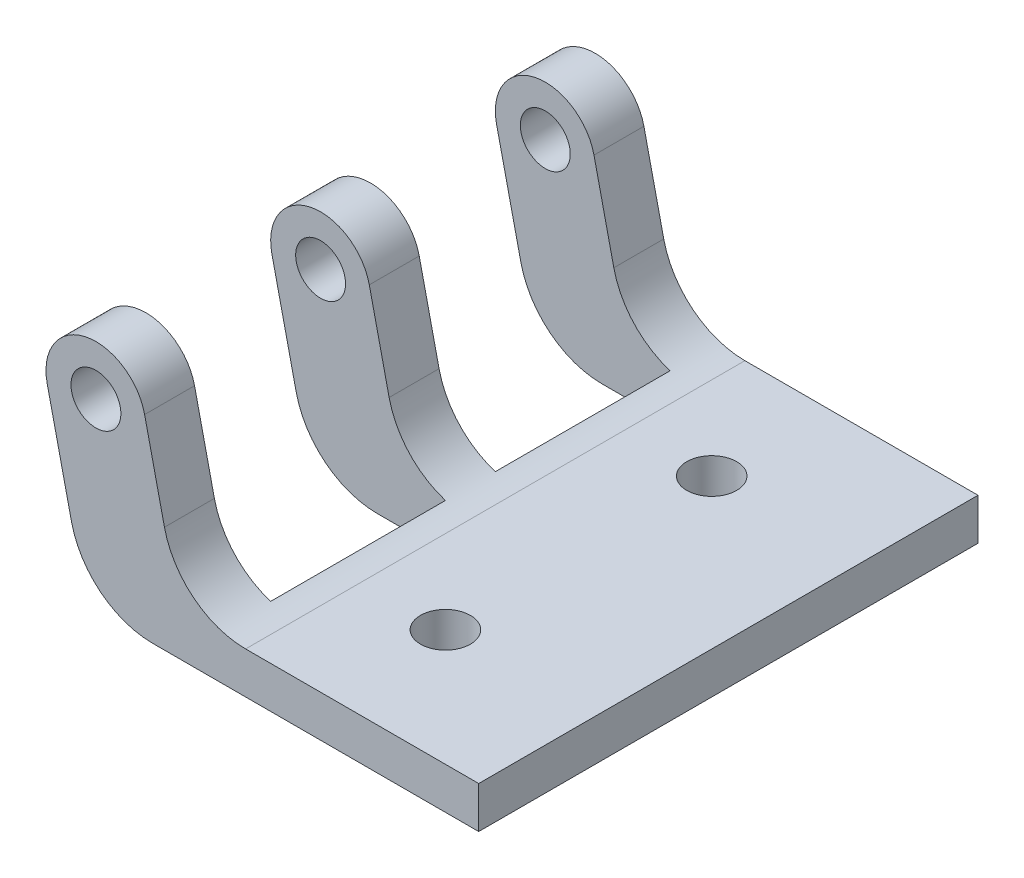
ISO-10303-21;
HEADER;
FILE_DESCRIPTION(('STEP AP214'),'2;1');
FILE_NAME('part.step','',(''),(''),'','','');
FILE_SCHEMA(('AUTOMOTIVE_DESIGN { 1 0 10303 214 1 1 1 1 }'));
ENDSEC;
DATA;
#1=APPLICATION_CONTEXT('core data for automotive mechanical design processes');
#2=APPLICATION_PROTOCOL_DEFINITION('international standard','automotive_design',2000,#1);
#3=PRODUCT_CONTEXT('',#1,'mechanical');
#4=PRODUCT('Part','Part','',(#3));
#5=PRODUCT_RELATED_PRODUCT_CATEGORY('part','',(#4));
#6=PRODUCT_DEFINITION_FORMATION('','',#4);
#7=PRODUCT_DEFINITION_CONTEXT('part definition',#1,'design');
#8=PRODUCT_DEFINITION('design','',#6,#7);
#9=PRODUCT_DEFINITION_SHAPE('','',#8);
#10=(LENGTH_UNIT() NAMED_UNIT(*) SI_UNIT(.MILLI.,.METRE.));
#11=(NAMED_UNIT(*) PLANE_ANGLE_UNIT() SI_UNIT($,.RADIAN.));
#12=(NAMED_UNIT(*) SI_UNIT($,.STERADIAN.) SOLID_ANGLE_UNIT());
#13=UNCERTAINTY_MEASURE_WITH_UNIT(LENGTH_MEASURE(1.E-05),#10,'distance_accuracy_value','');
#14=(GEOMETRIC_REPRESENTATION_CONTEXT(3) GLOBAL_UNCERTAINTY_ASSIGNED_CONTEXT((#13)) GLOBAL_UNIT_ASSIGNED_CONTEXT((#10,
#11,#12)) REPRESENTATION_CONTEXT('',''));
#15=CARTESIAN_POINT('',(0.,0.,0.));
#16=DIRECTION('',(0.,0.,1.));
#17=DIRECTION('',(1.,0.,0.));
#18=AXIS2_PLACEMENT_3D('',#15,#16,#17);
#19=CARTESIAN_POINT('',(-9.,0.,30.));
#20=DIRECTION('',(-0.97532391228008,-0.220778771929458,0.));
#21=DIRECTION('',(0.220778771929458,-0.97532391228008,0.));
#22=AXIS2_PLACEMENT_3D('',#19,#20,#21);
#23=PLANE('',#22);
#24=DIRECTION('',(0.,0.,-1.));
#25=VECTOR('',#24,1.);
#26=CARTESIAN_POINT('',(-11.0740282631598,9.16233631578837,30.));
#27=LINE('',#26,#25);
#28=CARTESIAN_POINT('',(-11.0740282631598,9.16233631578837,3.));
#29=VERTEX_POINT('',#28);
#30=CARTESIAN_POINT('',(-11.0740282631598,9.16233631578837,0.));
#31=VERTEX_POINT('',#30);
#32=EDGE_CURVE('E326',#29,#31,#27,.T.);
#33=ORIENTED_EDGE('',*,*,#32,.F.);
#34=DIRECTION('',(0.220778771929458,-0.97532391228008,0.));
#35=VECTOR('',#34,1.);
#36=CARTESIAN_POINT('',(-9.,0.,3.));
#37=LINE('',#36,#35);
#38=CARTESIAN_POINT('',(-9.88194036682951,3.89610614035271,3.));
#39=VERTEX_POINT('',#38);
#40=EDGE_CURVE('E259',#29,#39,#37,.T.);
#41=ORIENTED_EDGE('',*,*,#40,.T.);
#42=DIRECTION('',(0.,0.,-1.));
#43=VECTOR('',#42,1.);
#44=CARTESIAN_POINT('',(-9.88194036682951,3.89610614035271,0.));
#45=LINE('',#44,#43);
#46=CARTESIAN_POINT('',(-9.88194036682951,3.89610614035271,0.));
#47=VERTEX_POINT('',#46);
#48=EDGE_CURVE('E348',#39,#47,#45,.T.);
#49=ORIENTED_EDGE('',*,*,#48,.T.);
#50=DIRECTION('',(-0.220778771929458,0.97532391228008,0.));
#51=VECTOR('',#50,1.);
#52=CARTESIAN_POINT('',(-9.,0.,0.));
#53=LINE('',#52,#51);
#54=EDGE_CURVE('E310',#47,#31,#53,.T.);
#55=ORIENTED_EDGE('',*,*,#54,.T.);
#56=EDGE_LOOP('',(#33,#41,#49,#55));
#57=FACE_BOUND('',#56,.T.);
#58=ADVANCED_FACE('F32',(#57),#23,.F.);
#59=CARTESIAN_POINT('',(-9.88194036682951,3.89610614035271,16.5));
#60=VERTEX_POINT('',#59);
#61=CARTESIAN_POINT('',(-9.88194036682951,3.89610614035271,13.5));
#62=VERTEX_POINT('',#61);
#63=EDGE_CURVE('E353',#60,#62,#45,.T.);
#64=ORIENTED_EDGE('',*,*,#63,.T.);
#65=DIRECTION('',(-0.220778771929458,0.97532391228008,0.));
#66=VECTOR('',#65,1.);
#67=CARTESIAN_POINT('',(-9.,0.,13.5));
#68=LINE('',#67,#66);
#69=CARTESIAN_POINT('',(-11.0740282631598,9.16233631578837,13.5));
#70=VERTEX_POINT('',#69);
#71=EDGE_CURVE('E47',#62,#70,#68,.T.);
#72=ORIENTED_EDGE('',*,*,#71,.T.);
#73=CARTESIAN_POINT('',(-11.0740282631598,9.16233631578837,16.5));
#74=VERTEX_POINT('',#73);
#75=EDGE_CURVE('E332',#74,#70,#27,.T.);
#76=ORIENTED_EDGE('',*,*,#75,.F.);
#77=DIRECTION('',(0.220778771929458,-0.97532391228008,0.));
#78=VECTOR('',#77,1.);
#79=CARTESIAN_POINT('',(-9.,0.,16.5));
#80=LINE('',#79,#78);
#81=EDGE_CURVE('E235',#74,#60,#80,.T.);
#82=ORIENTED_EDGE('',*,*,#81,.T.);
#83=EDGE_LOOP('',(#64,#72,#76,#82));
#84=FACE_BOUND('',#83,.T.);
#85=ADVANCED_FACE('F453',(#84),#23,.F.);
#86=CARTESIAN_POINT('',(-14.,8.5,30.));
#87=DIRECTION('',(0.,0.,-1.));
#88=DIRECTION('',(-1.,0.,0.));
#89=AXIS2_PLACEMENT_3D('',#86,#87,#88);
#90=CYLINDRICAL_SURFACE('',#89,3.);
#91=CARTESIAN_POINT('',(-14.,8.5,3.));
#92=DIRECTION('',(0.,0.,-1.));
#93=DIRECTION('',(-1.,0.,0.));
#94=AXIS2_PLACEMENT_3D('',#91,#92,#93);
#95=CIRCLE('',#94,3.);
#96=CARTESIAN_POINT('',(-16.9259717368402,7.83766368421163,3.));
#97=VERTEX_POINT('',#96);
#98=EDGE_CURVE('E262',#97,#29,#95,.T.);
#99=ORIENTED_EDGE('',*,*,#98,.T.);
#100=ORIENTED_EDGE('',*,*,#32,.T.);
#101=CARTESIAN_POINT('',(-14.,8.5,0.));
#102=DIRECTION('',(0.,0.,1.));
#103=DIRECTION('',(1.,0.,0.));
#104=AXIS2_PLACEMENT_3D('',#101,#102,#103);
#105=CIRCLE('',#104,3.);
#106=CARTESIAN_POINT('',(-16.9259717368402,7.83766368421163,0.));
#107=VERTEX_POINT('',#106);
#108=EDGE_CURVE('E313',#31,#107,#105,.T.);
#109=ORIENTED_EDGE('',*,*,#108,.T.);
#110=DIRECTION('',(0.,0.,-1.));
#111=VECTOR('',#110,1.);
#112=CARTESIAN_POINT('',(-16.9259717368402,7.83766368421163,30.));
#113=LINE('',#112,#111);
#114=EDGE_CURVE('E322',#97,#107,#113,.T.);
#115=ORIENTED_EDGE('',*,*,#114,.F.);
#116=EDGE_LOOP('',(#99,#100,#109,#115));
#117=FACE_BOUND('',#116,.T.);
#118=ADVANCED_FACE('F438',(#117),#90,.T.);
#119=CARTESIAN_POINT('',(-14.,8.5,13.5));
#120=DIRECTION('',(0.,0.,1.));
#121=DIRECTION('',(1.,0.,0.));
#122=AXIS2_PLACEMENT_3D('',#119,#120,#121);
#123=CIRCLE('',#122,3.);
#124=CARTESIAN_POINT('',(-16.9259717368402,7.83766368421163,13.5));
#125=VERTEX_POINT('',#124);
#126=EDGE_CURVE('E249',#70,#125,#123,.T.);
#127=ORIENTED_EDGE('',*,*,#126,.T.);
#128=CARTESIAN_POINT('',(-16.9259717368402,7.83766368421163,16.5));
#129=VERTEX_POINT('',#128);
#130=EDGE_CURVE('E327',#129,#125,#113,.T.);
#131=ORIENTED_EDGE('',*,*,#130,.F.);
#132=CARTESIAN_POINT('',(-14.,8.5,16.5));
#133=DIRECTION('',(0.,0.,-1.));
#134=DIRECTION('',(-1.,0.,0.));
#135=AXIS2_PLACEMENT_3D('',#132,#133,#134);
#136=CIRCLE('',#135,3.);
#137=EDGE_CURVE('E238',#129,#74,#136,.T.);
#138=ORIENTED_EDGE('',*,*,#137,.T.);
#139=ORIENTED_EDGE('',*,*,#75,.T.);
#140=EDGE_LOOP('',(#127,#131,#138,#139));
#141=FACE_BOUND('',#140,.T.);
#142=ADVANCED_FACE('F464',(#141),#90,.T.);
#143=CARTESIAN_POINT('',(-14.5858910066504,-2.5,30.));
#144=DIRECTION('',(0.97532391228008,0.220778771929458,0.));
#145=DIRECTION('',(-0.220778771929458,0.97532391228008,0.));
#146=AXIS2_PLACEMENT_3D('',#143,#144,#145);
#147=PLANE('',#146);
#148=DIRECTION('',(0.,0.,-1.));
#149=VECTOR('',#148,1.);
#150=CARTESIAN_POINT('',(-15.4678313734799,1.39610614035271,30.));
#151=LINE('',#150,#149);
#152=CARTESIAN_POINT('',(-15.4678313734799,1.39610614035271,0.));
#153=VERTEX_POINT('',#152);
#154=CARTESIAN_POINT('',(-15.4678313734799,1.39610614035271,3.));
#155=VERTEX_POINT('',#154);
#156=EDGE_CURVE('E342',#153,#155,#151,.F.);
#157=ORIENTED_EDGE('',*,*,#156,.T.);
#158=DIRECTION('',(-0.220778771929458,0.97532391228008,0.));
#159=VECTOR('',#158,1.);
#160=CARTESIAN_POINT('',(-14.5858910066504,-2.5,3.));
#161=LINE('',#160,#159);
#162=EDGE_CURVE('E264',#155,#97,#161,.T.);
#163=ORIENTED_EDGE('',*,*,#162,.T.);
#164=ORIENTED_EDGE('',*,*,#114,.T.);
#165=DIRECTION('',(0.220778771929458,-0.97532391228008,0.));
#166=VECTOR('',#165,1.);
#167=CARTESIAN_POINT('',(-14.5858910066504,-2.5,0.));
#168=LINE('',#167,#166);
#169=EDGE_CURVE('E316',#107,#153,#168,.T.);
#170=ORIENTED_EDGE('',*,*,#169,.T.);
#171=EDGE_LOOP('',(#157,#163,#164,#170));
#172=FACE_BOUND('',#171,.T.);
#173=ADVANCED_FACE('F435',(#172),#147,.F.);
#174=ORIENTED_EDGE('',*,*,#130,.T.);
#175=DIRECTION('',(0.220778771929458,-0.97532391228008,0.));
#176=VECTOR('',#175,1.);
#177=CARTESIAN_POINT('',(-14.5858910066504,-2.5,13.5));
#178=LINE('',#177,#176);
#179=CARTESIAN_POINT('',(-15.4678313734799,1.39610614035271,13.5));
#180=VERTEX_POINT('',#179);
#181=EDGE_CURVE('E251',#125,#180,#178,.T.);
#182=ORIENTED_EDGE('',*,*,#181,.T.);
#183=CARTESIAN_POINT('',(-15.4678313734799,1.39610614035271,16.5));
#184=VERTEX_POINT('',#183);
#185=EDGE_CURVE('E346',#180,#184,#151,.F.);
#186=ORIENTED_EDGE('',*,*,#185,.T.);
#187=DIRECTION('',(-0.220778771929458,0.97532391228008,0.));
#188=VECTOR('',#187,1.);
#189=CARTESIAN_POINT('',(-14.5858910066504,-2.5,16.5));
#190=LINE('',#189,#188);
#191=EDGE_CURVE('E240',#184,#129,#190,.T.);
#192=ORIENTED_EDGE('',*,*,#191,.T.);
#193=EDGE_LOOP('',(#174,#182,#186,#192));
#194=FACE_BOUND('',#193,.T.);
#195=ADVANCED_FACE('F430',(#194),#147,.F.);
#196=CARTESIAN_POINT('',(-14.,8.5,30.));
#197=DIRECTION('',(0.,0.,-1.));
#198=DIRECTION('',(-1.,0.,0.));
#199=AXIS2_PLACEMENT_3D('',#196,#197,#198);
#200=CYLINDRICAL_SURFACE('',#199,1.5);
#201=CARTESIAN_POINT('',(-14.,8.5,3.));
#202=DIRECTION('',(0.,0.,-1.));
#203=DIRECTION('',(-1.,0.,0.));
#204=AXIS2_PLACEMENT_3D('',#201,#202,#203);
#205=CIRCLE('',#204,1.5);
#206=CARTESIAN_POINT('',(-15.5,8.5,3.));
#207=VERTEX_POINT('',#206);
#208=EDGE_CURVE('E269',#207,#207,#205,.T.);
#209=ORIENTED_EDGE('',*,*,#208,.F.);
#210=EDGE_LOOP('',(#209));
#211=FACE_BOUND('',#210,.T.);
#212=CARTESIAN_POINT('',(-14.,8.5,0.));
#213=DIRECTION('',(0.,0.,1.));
#214=DIRECTION('',(1.,0.,0.));
#215=AXIS2_PLACEMENT_3D('',#212,#213,#214);
#216=CIRCLE('',#215,1.5);
#217=CARTESIAN_POINT('',(-12.5,8.5,0.));
#218=VERTEX_POINT('',#217);
#219=EDGE_CURVE('E281',#218,#218,#216,.T.);
#220=ORIENTED_EDGE('',*,*,#219,.F.);
#221=EDGE_LOOP('',(#220));
#222=FACE_BOUND('',#221,.T.);
#223=ADVANCED_FACE('F478',(#211,#222),#200,.F.);
#224=CARTESIAN_POINT('',(-10.5912118120795,2.5,30.));
#225=DIRECTION('',(0.,0.,-1.));
#226=DIRECTION('',(-1.,0.,0.));
#227=AXIS2_PLACEMENT_3D('',#224,#225,#226);
#228=CYLINDRICAL_SURFACE('',#227,5.);
#229=CARTESIAN_POINT('',(-10.5912118120795,2.5,3.));
#230=DIRECTION('',(0.,0.,-1.));
#231=DIRECTION('',(-1.,0.,0.));
#232=AXIS2_PLACEMENT_3D('',#229,#230,#231);
#233=CIRCLE('',#232,5.);
#234=CARTESIAN_POINT('',(-10.5912118120795,-2.5,3.));
#235=VERTEX_POINT('',#234);
#236=EDGE_CURVE('E267',#155,#235,#233,.F.);
#237=ORIENTED_EDGE('',*,*,#236,.F.);
#238=ORIENTED_EDGE('',*,*,#156,.F.);
#239=CARTESIAN_POINT('',(-10.5912118120795,2.5,0.));
#240=DIRECTION('',(0.,0.,1.));
#241=DIRECTION('',(1.,0.,0.));
#242=AXIS2_PLACEMENT_3D('',#239,#240,#241);
#243=CIRCLE('',#242,5.);
#244=CARTESIAN_POINT('',(-10.5912118120795,-2.5,0.));
#245=VERTEX_POINT('',#244);
#246=EDGE_CURVE('E339',#245,#153,#243,.F.);
#247=ORIENTED_EDGE('',*,*,#246,.F.);
#248=DIRECTION('',(0.,0.,-1.));
#249=VECTOR('',#248,1.);
#250=CARTESIAN_POINT('',(-10.5912118120795,-2.5,30.));
#251=LINE('',#250,#249);
#252=EDGE_CURVE('E335',#235,#245,#251,.T.);
#253=ORIENTED_EDGE('',*,*,#252,.F.);
#254=EDGE_LOOP('',(#237,#238,#247,#253));
#255=FACE_BOUND('',#254,.T.);
#256=ADVANCED_FACE('F378',(#255),#228,.T.);
#257=CARTESIAN_POINT('',(-10.5912118120795,2.5,13.5));
#258=DIRECTION('',(0.,0.,1.));
#259=DIRECTION('',(1.,0.,0.));
#260=AXIS2_PLACEMENT_3D('',#257,#258,#259);
#261=CIRCLE('',#260,5.);
#262=CARTESIAN_POINT('',(-10.5912118120795,-2.5,13.5));
#263=VERTEX_POINT('',#262);
#264=EDGE_CURVE('E254',#263,#180,#261,.F.);
#265=ORIENTED_EDGE('',*,*,#264,.F.);
#266=CARTESIAN_POINT('',(-10.5912118120795,-2.5,16.5));
#267=VERTEX_POINT('',#266);
#268=EDGE_CURVE('E203',#267,#263,#251,.T.);
#269=ORIENTED_EDGE('',*,*,#268,.F.);
#270=CARTESIAN_POINT('',(-10.5912118120795,2.5,16.5));
#271=DIRECTION('',(0.,0.,-1.));
#272=DIRECTION('',(-1.,0.,0.));
#273=AXIS2_PLACEMENT_3D('',#270,#271,#272);
#274=CIRCLE('',#273,5.);
#275=EDGE_CURVE('E243',#184,#267,#274,.F.);
#276=ORIENTED_EDGE('',*,*,#275,.F.);
#277=ORIENTED_EDGE('',*,*,#185,.F.);
#278=EDGE_LOOP('',(#265,#269,#276,#277));
#279=FACE_BOUND('',#278,.T.);
#280=ADVANCED_FACE('F424',(#279),#228,.T.);
#281=CARTESIAN_POINT('',(-14.,8.5,30.));
#282=DIRECTION('',(0.,0.,1.));
#283=DIRECTION('',(1.,0.,0.));
#284=AXIS2_PLACEMENT_3D('',#281,#282,#283);
#285=PLANE('',#284);
#286=DIRECTION('',(0.220778771929458,-0.97532391228008,0.));
#287=VECTOR('',#286,1.);
#288=CARTESIAN_POINT('',(-14.5858910066504,-2.5,30.));
#289=LINE('',#288,#287);
#290=CARTESIAN_POINT('',(-16.9259717368402,7.83766368421163,30.));
#291=VERTEX_POINT('',#290);
#292=CARTESIAN_POINT('',(-15.4678313734799,1.39610614035271,30.));
#293=VERTEX_POINT('',#292);
#294=EDGE_CURVE('E299',#291,#293,#289,.T.);
#295=ORIENTED_EDGE('',*,*,#294,.T.);
#296=CARTESIAN_POINT('',(-10.5912118120795,2.5,30.));
#297=DIRECTION('',(0.,0.,1.));
#298=DIRECTION('',(1.,0.,0.));
#299=AXIS2_PLACEMENT_3D('',#296,#297,#298);
#300=CIRCLE('',#299,5.);
#301=CARTESIAN_POINT('',(-10.5912118120795,-2.5,30.));
#302=VERTEX_POINT('',#301);
#303=EDGE_CURVE('E345',#293,#302,#300,.T.);
#304=ORIENTED_EDGE('',*,*,#303,.T.);
#305=DIRECTION('',(1.,0.,0.));
#306=VECTOR('',#305,1.);
#307=CARTESIAN_POINT('',(9.,-2.5,30.));
#308=LINE('',#307,#306);
#309=CARTESIAN_POINT('',(9.,-2.5,30.));
#310=VERTEX_POINT('',#309);
#311=EDGE_CURVE('E302',#302,#310,#308,.T.);
#312=ORIENTED_EDGE('',*,*,#311,.T.);
#313=DIRECTION('',(0.,1.,0.));
#314=VECTOR('',#313,1.);
#315=CARTESIAN_POINT('',(9.,0.,30.));
#316=LINE('',#315,#314);
#317=CARTESIAN_POINT('',(9.,0.,30.));
#318=VERTEX_POINT('',#317);
#319=EDGE_CURVE('E288',#310,#318,#316,.T.);
#320=ORIENTED_EDGE('',*,*,#319,.T.);
#321=DIRECTION('',(-1.,0.,0.));
#322=VECTOR('',#321,1.);
#323=CARTESIAN_POINT('',(-9.,0.,30.));
#324=LINE('',#323,#322);
#325=CARTESIAN_POINT('',(-5.00532080542912,0.,30.));
#326=VERTEX_POINT('',#325);
#327=EDGE_CURVE('E291',#318,#326,#324,.T.);
#328=ORIENTED_EDGE('',*,*,#327,.T.);
#329=CARTESIAN_POINT('',(-5.00532080542912,5.,30.));
#330=DIRECTION('',(0.,0.,1.));
#331=DIRECTION('',(1.,0.,0.));
#332=AXIS2_PLACEMENT_3D('',#329,#330,#331);
#333=CIRCLE('',#332,5.);
#334=CARTESIAN_POINT('',(-9.88194036682951,3.89610614035271,30.));
#335=VERTEX_POINT('',#334);
#336=EDGE_CURVE('E357',#326,#335,#333,.F.);
#337=ORIENTED_EDGE('',*,*,#336,.T.);
#338=DIRECTION('',(-0.220778771929458,0.97532391228008,0.));
#339=VECTOR('',#338,1.);
#340=CARTESIAN_POINT('',(-9.,0.,30.));
#341=LINE('',#340,#339);
#342=CARTESIAN_POINT('',(-11.0740282631598,9.16233631578837,30.));
#343=VERTEX_POINT('',#342);
#344=EDGE_CURVE('E295',#335,#343,#341,.T.);
#345=ORIENTED_EDGE('',*,*,#344,.T.);
#346=CARTESIAN_POINT('',(-14.,8.5,30.));
#347=DIRECTION('',(0.,0.,1.));
#348=DIRECTION('',(1.,0.,0.));
#349=AXIS2_PLACEMENT_3D('',#346,#347,#348);
#350=CIRCLE('',#349,3.);
#351=EDGE_CURVE('E297',#343,#291,#350,.T.);
#352=ORIENTED_EDGE('',*,*,#351,.T.);
#353=EDGE_LOOP('',(#295,#304,#312,#320,#328,#337,#345,#352));
#354=FACE_BOUND('',#353,.T.);
#355=CARTESIAN_POINT('',(-14.,8.5,30.));
#356=DIRECTION('',(0.,0.,1.));
#357=DIRECTION('',(1.,0.,0.));
#358=AXIS2_PLACEMENT_3D('',#355,#356,#357);
#359=CIRCLE('',#358,1.5);
#360=CARTESIAN_POINT('',(-12.5,8.5,30.));
#361=VERTEX_POINT('',#360);
#362=EDGE_CURVE('E282',#361,#361,#359,.T.);
#363=ORIENTED_EDGE('',*,*,#362,.F.);
#364=EDGE_LOOP('',(#363));
#365=FACE_BOUND('',#364,.T.);
#366=ADVANCED_FACE('F393',(#354,#365),#285,.T.);
#367=CARTESIAN_POINT('',(-14.,8.5,0.));
#368=DIRECTION('',(0.,0.,1.));
#369=DIRECTION('',(1.,0.,0.));
#370=AXIS2_PLACEMENT_3D('',#367,#368,#369);
#371=PLANE('',#370);
#372=DIRECTION('',(1.,0.,0.));
#373=VECTOR('',#372,1.);
#374=CARTESIAN_POINT('',(9.,-2.5,0.));
#375=LINE('',#374,#373);
#376=CARTESIAN_POINT('',(9.,-2.5,0.));
#377=VERTEX_POINT('',#376);
#378=EDGE_CURVE('E292',#245,#377,#375,.T.);
#379=ORIENTED_EDGE('',*,*,#378,.F.);
#380=ORIENTED_EDGE('',*,*,#246,.T.);
#381=ORIENTED_EDGE('',*,*,#169,.F.);
#382=ORIENTED_EDGE('',*,*,#108,.F.);
#383=ORIENTED_EDGE('',*,*,#54,.F.);
#384=CARTESIAN_POINT('',(-5.00532080542912,5.,0.));
#385=DIRECTION('',(0.,0.,1.));
#386=DIRECTION('',(1.,0.,0.));
#387=AXIS2_PLACEMENT_3D('',#384,#385,#386);
#388=CIRCLE('',#387,5.);
#389=CARTESIAN_POINT('',(-5.00532080542912,0.,0.));
#390=VERTEX_POINT('',#389);
#391=EDGE_CURVE('E355',#47,#390,#388,.T.);
#392=ORIENTED_EDGE('',*,*,#391,.T.);
#393=DIRECTION('',(-1.,0.,0.));
#394=VECTOR('',#393,1.);
#395=CARTESIAN_POINT('',(-9.,0.,0.));
#396=LINE('',#395,#394);
#397=CARTESIAN_POINT('',(9.,0.,0.));
#398=VERTEX_POINT('',#397);
#399=EDGE_CURVE('E307',#398,#390,#396,.T.);
#400=ORIENTED_EDGE('',*,*,#399,.F.);
#401=DIRECTION('',(0.,1.,0.));
#402=VECTOR('',#401,1.);
#403=CARTESIAN_POINT('',(9.,0.,0.));
#404=LINE('',#403,#402);
#405=EDGE_CURVE('E285',#377,#398,#404,.T.);
#406=ORIENTED_EDGE('',*,*,#405,.F.);
#407=EDGE_LOOP('',(#379,#380,#381,#382,#383,#392,#400,#406));
#408=FACE_BOUND('',#407,.T.);
#409=ORIENTED_EDGE('',*,*,#219,.T.);
#410=EDGE_LOOP('',(#409));
#411=FACE_BOUND('',#410,.T.);
#412=ADVANCED_FACE('F384',(#408,#411),#371,.F.);
#413=CARTESIAN_POINT('',(9.,0.,30.));
#414=DIRECTION('',(-1.,0.,0.));
#415=DIRECTION('',(0.,0.,1.));
#416=AXIS2_PLACEMENT_3D('',#413,#414,#415);
#417=PLANE('',#416);
#418=ORIENTED_EDGE('',*,*,#405,.T.);
#419=DIRECTION('',(0.,0.,-1.));
#420=VECTOR('',#419,1.);
#421=CARTESIAN_POINT('',(9.,0.,30.));
#422=LINE('',#421,#420);
#423=EDGE_CURVE('E331',#318,#398,#422,.T.);
#424=ORIENTED_EDGE('',*,*,#423,.F.);
#425=ORIENTED_EDGE('',*,*,#319,.F.);
#426=DIRECTION('',(0.,0.,-1.));
#427=VECTOR('',#426,1.);
#428=CARTESIAN_POINT('',(9.,-2.5,30.));
#429=LINE('',#428,#427);
#430=EDGE_CURVE('E304',#310,#377,#429,.T.);
#431=ORIENTED_EDGE('',*,*,#430,.T.);
#432=EDGE_LOOP('',(#418,#424,#425,#431));
#433=FACE_BOUND('',#432,.T.);
#434=ADVANCED_FACE('F390',(#433),#417,.F.);
#435=CARTESIAN_POINT('',(-9.,0.,30.));
#436=DIRECTION('',(0.,-1.,0.));
#437=DIRECTION('',(1.,0.,0.));
#438=AXIS2_PLACEMENT_3D('',#435,#436,#437);
#439=PLANE('',#438);
#440=CARTESIAN_POINT('',(0.,0.,23.));
#441=DIRECTION('',(0.,-1.,0.));
#442=DIRECTION('',(1.,0.,0.));
#443=AXIS2_PLACEMENT_3D('',#440,#441,#442);
#444=CIRCLE('',#443,1.5);
#445=CARTESIAN_POINT('',(1.5,0.,23.));
#446=VERTEX_POINT('',#445);
#447=EDGE_CURVE('E272',#446,#446,#444,.T.);
#448=ORIENTED_EDGE('',*,*,#447,.T.);
#449=EDGE_LOOP('',(#448));
#450=FACE_BOUND('',#449,.T.);
#451=CARTESIAN_POINT('',(0.,0.,7.));
#452=DIRECTION('',(0.,-1.,0.));
#453=DIRECTION('',(1.,0.,0.));
#454=AXIS2_PLACEMENT_3D('',#451,#452,#453);
#455=CIRCLE('',#454,1.5);
#456=CARTESIAN_POINT('',(1.5,0.,7.));
#457=VERTEX_POINT('',#456);
#458=EDGE_CURVE('E278',#457,#457,#455,.T.);
#459=ORIENTED_EDGE('',*,*,#458,.T.);
#460=EDGE_LOOP('',(#459));
#461=FACE_BOUND('',#460,.T.);
#462=ORIENTED_EDGE('',*,*,#399,.T.);
#463=DIRECTION('',(0.,0.,-1.));
#464=VECTOR('',#463,1.);
#465=CARTESIAN_POINT('',(-5.00532080542912,0.,30.));
#466=LINE('',#465,#464);
#467=EDGE_CURVE('E352',#390,#326,#466,.F.);
#468=ORIENTED_EDGE('',*,*,#467,.T.);
#469=ORIENTED_EDGE('',*,*,#327,.F.);
#470=ORIENTED_EDGE('',*,*,#423,.T.);
#471=EDGE_LOOP('',(#462,#468,#469,#470));
#472=FACE_BOUND('',#471,.T.);
#473=ADVANCED_FACE('F444',(#450,#461,#472),#439,.F.);
#474=CARTESIAN_POINT('',(-9.88194036682951,3.89610614035271,27.));
#475=VERTEX_POINT('',#474);
#476=EDGE_CURVE('E349',#335,#475,#45,.T.);
#477=ORIENTED_EDGE('',*,*,#476,.T.);
#478=DIRECTION('',(-0.220778771929458,0.97532391228008,0.));
#479=VECTOR('',#478,1.);
#480=CARTESIAN_POINT('',(-9.,0.,27.));
#481=LINE('',#480,#479);
#482=CARTESIAN_POINT('',(-11.0740282631598,9.16233631578837,27.));
#483=VERTEX_POINT('',#482);
#484=EDGE_CURVE('E55',#475,#483,#481,.T.);
#485=ORIENTED_EDGE('',*,*,#484,.T.);
#486=EDGE_CURVE('E328',#343,#483,#27,.T.);
#487=ORIENTED_EDGE('',*,*,#486,.F.);
#488=ORIENTED_EDGE('',*,*,#344,.F.);
#489=EDGE_LOOP('',(#477,#485,#487,#488));
#490=FACE_BOUND('',#489,.T.);
#491=ADVANCED_FACE('F413',(#490),#23,.F.);
#492=CARTESIAN_POINT('',(-14.,8.5,27.));
#493=DIRECTION('',(0.,0.,1.));
#494=DIRECTION('',(1.,0.,0.));
#495=AXIS2_PLACEMENT_3D('',#492,#493,#494);
#496=CIRCLE('',#495,3.);
#497=CARTESIAN_POINT('',(-16.9259717368402,7.83766368421163,27.));
#498=VERTEX_POINT('',#497);
#499=EDGE_CURVE('E225',#483,#498,#496,.T.);
#500=ORIENTED_EDGE('',*,*,#499,.T.);
#501=EDGE_CURVE('E323',#291,#498,#113,.T.);
#502=ORIENTED_EDGE('',*,*,#501,.F.);
#503=ORIENTED_EDGE('',*,*,#351,.F.);
#504=ORIENTED_EDGE('',*,*,#486,.T.);
#505=EDGE_LOOP('',(#500,#502,#503,#504));
#506=FACE_BOUND('',#505,.T.);
#507=ADVANCED_FACE('F410',(#506),#90,.T.);
#508=ORIENTED_EDGE('',*,*,#501,.T.);
#509=DIRECTION('',(0.220778771929458,-0.97532391228008,0.));
#510=VECTOR('',#509,1.);
#511=CARTESIAN_POINT('',(-14.5858910066504,-2.5,27.));
#512=LINE('',#511,#510);
#513=CARTESIAN_POINT('',(-15.4678313734799,1.39610614035271,27.));
#514=VERTEX_POINT('',#513);
#515=EDGE_CURVE('E227',#498,#514,#512,.T.);
#516=ORIENTED_EDGE('',*,*,#515,.T.);
#517=EDGE_CURVE('E341',#514,#293,#151,.F.);
#518=ORIENTED_EDGE('',*,*,#517,.T.);
#519=ORIENTED_EDGE('',*,*,#294,.F.);
#520=EDGE_LOOP('',(#508,#516,#518,#519));
#521=FACE_BOUND('',#520,.T.);
#522=ADVANCED_FACE('F405',(#521),#147,.F.);
#523=CARTESIAN_POINT('',(9.,-2.5,30.));
#524=DIRECTION('',(0.,1.,0.));
#525=DIRECTION('',(-1.,0.,0.));
#526=AXIS2_PLACEMENT_3D('',#523,#524,#525);
#527=PLANE('',#526);
#528=CARTESIAN_POINT('',(0.,-2.5,23.));
#529=DIRECTION('',(0.,1.,0.));
#530=DIRECTION('',(-1.,0.,0.));
#531=AXIS2_PLACEMENT_3D('',#528,#529,#530);
#532=CIRCLE('',#531,1.5);
#533=CARTESIAN_POINT('',(-1.5,-2.5,23.));
#534=VERTEX_POINT('',#533);
#535=EDGE_CURVE('E210',#534,#534,#532,.T.);
#536=ORIENTED_EDGE('',*,*,#535,.T.);
#537=EDGE_LOOP('',(#536));
#538=FACE_BOUND('',#537,.T.);
#539=CARTESIAN_POINT('',(0.,-2.5,7.));
#540=DIRECTION('',(0.,1.,0.));
#541=DIRECTION('',(-1.,0.,0.));
#542=AXIS2_PLACEMENT_3D('',#539,#540,#541);
#543=CIRCLE('',#542,1.5);
#544=CARTESIAN_POINT('',(-1.5,-2.5,7.));
#545=VERTEX_POINT('',#544);
#546=EDGE_CURVE('E275',#545,#545,#543,.T.);
#547=ORIENTED_EDGE('',*,*,#546,.T.);
#548=EDGE_LOOP('',(#547));
#549=FACE_BOUND('',#548,.T.);
#550=DIRECTION('',(0.,0.,-1.));
#551=VECTOR('',#550,1.);
#552=CARTESIAN_POINT('',(-6.49999999999999,-2.5,3.));
#553=LINE('',#552,#551);
#554=CARTESIAN_POINT('',(-6.49999999999999,-2.5,13.5));
#555=VERTEX_POINT('',#554);
#556=CARTESIAN_POINT('',(-6.49999999999999,-2.5,3.));
#557=VERTEX_POINT('',#556);
#558=EDGE_CURVE('E192',#555,#557,#553,.T.);
#559=ORIENTED_EDGE('',*,*,#558,.T.);
#560=DIRECTION('',(-1.,0.,0.));
#561=VECTOR('',#560,1.);
#562=CARTESIAN_POINT('',(-17.,-2.5,3.));
#563=LINE('',#562,#561);
#564=EDGE_CURVE('E189',#557,#235,#563,.T.);
#565=ORIENTED_EDGE('',*,*,#564,.T.);
#566=ORIENTED_EDGE('',*,*,#252,.T.);
#567=ORIENTED_EDGE('',*,*,#378,.T.);
#568=ORIENTED_EDGE('',*,*,#430,.F.);
#569=ORIENTED_EDGE('',*,*,#311,.F.);
#570=CARTESIAN_POINT('',(-10.5912118120795,-2.5,27.));
#571=VERTEX_POINT('',#570);
#572=EDGE_CURVE('E336',#302,#571,#251,.T.);
#573=ORIENTED_EDGE('',*,*,#572,.T.);
#574=DIRECTION('',(1.,0.,0.));
#575=VECTOR('',#574,1.);
#576=CARTESIAN_POINT('',(-17.,-2.5,27.));
#577=LINE('',#576,#575);
#578=CARTESIAN_POINT('',(-6.49999999999999,-2.5,27.));
#579=VERTEX_POINT('',#578);
#580=EDGE_CURVE('E214',#571,#579,#577,.T.);
#581=ORIENTED_EDGE('',*,*,#580,.T.);
#582=DIRECTION('',(0.,0.,-1.));
#583=VECTOR('',#582,1.);
#584=CARTESIAN_POINT('',(-6.49999999999999,-2.5,16.5));
#585=LINE('',#584,#583);
#586=CARTESIAN_POINT('',(-6.49999999999999,-2.5,16.5));
#587=VERTEX_POINT('',#586);
#588=EDGE_CURVE('E217',#579,#587,#585,.T.);
#589=ORIENTED_EDGE('',*,*,#588,.T.);
#590=DIRECTION('',(-1.,0.,0.));
#591=VECTOR('',#590,1.);
#592=CARTESIAN_POINT('',(-17.,-2.5,16.5));
#593=LINE('',#592,#591);
#594=EDGE_CURVE('E220',#587,#267,#593,.T.);
#595=ORIENTED_EDGE('',*,*,#594,.T.);
#596=ORIENTED_EDGE('',*,*,#268,.T.);
#597=DIRECTION('',(1.,0.,0.));
#598=VECTOR('',#597,1.);
#599=CARTESIAN_POINT('',(-17.,-2.5,13.5));
#600=LINE('',#599,#598);
#601=EDGE_CURVE('E183',#263,#555,#600,.T.);
#602=ORIENTED_EDGE('',*,*,#601,.T.);
#603=EDGE_LOOP('',(#559,#565,#566,#567,#568,#569,#573,#581,#589,#595,#596,#602));
#604=FACE_BOUND('',#603,.T.);
#605=ADVANCED_FACE('F200',(#538,#549,#604),#527,.F.);
#606=CARTESIAN_POINT('',(-14.,8.5,27.));
#607=DIRECTION('',(0.,0.,1.));
#608=DIRECTION('',(1.,0.,0.));
#609=AXIS2_PLACEMENT_3D('',#606,#607,#608);
#610=CIRCLE('',#609,1.5);
#611=CARTESIAN_POINT('',(-12.5,8.5,27.));
#612=VERTEX_POINT('',#611);
#613=EDGE_CURVE('E232',#612,#612,#610,.T.);
#614=ORIENTED_EDGE('',*,*,#613,.F.);
#615=EDGE_LOOP('',(#614));
#616=FACE_BOUND('',#615,.T.);
#617=ORIENTED_EDGE('',*,*,#362,.T.);
#618=EDGE_LOOP('',(#617));
#619=FACE_BOUND('',#618,.T.);
#620=ADVANCED_FACE('F469',(#616,#619),#200,.F.);
#621=CARTESIAN_POINT('',(-10.5912118120795,2.5,27.));
#622=DIRECTION('',(0.,0.,1.));
#623=DIRECTION('',(1.,0.,0.));
#624=AXIS2_PLACEMENT_3D('',#621,#622,#623);
#625=CIRCLE('',#624,5.);
#626=EDGE_CURVE('E230',#571,#514,#625,.F.);
#627=ORIENTED_EDGE('',*,*,#626,.F.);
#628=ORIENTED_EDGE('',*,*,#572,.F.);
#629=ORIENTED_EDGE('',*,*,#303,.F.);
#630=ORIENTED_EDGE('',*,*,#517,.F.);
#631=EDGE_LOOP('',(#627,#628,#629,#630));
#632=FACE_BOUND('',#631,.T.);
#633=ADVANCED_FACE('F400',(#632),#228,.T.);
#634=CARTESIAN_POINT('',(-5.00532080542912,5.,30.));
#635=DIRECTION('',(0.,0.,1.));
#636=DIRECTION('',(1.,0.,0.));
#637=AXIS2_PLACEMENT_3D('',#634,#635,#636);
#638=CYLINDRICAL_SURFACE('',#637,5.);
#639=ORIENTED_EDGE('',*,*,#48,.F.);
#640=CARTESIAN_POINT('',(-5.00532080542912,5.,3.));
#641=DIRECTION('',(0.,0.,-1.));
#642=DIRECTION('',(-1.,0.,0.));
#643=AXIS2_PLACEMENT_3D('',#640,#641,#642);
#644=CIRCLE('',#643,5.);
#645=CARTESIAN_POINT('',(-6.5,0.228633937191891,3.));
#646=VERTEX_POINT('',#645);
#647=EDGE_CURVE('E11',#39,#646,#644,.F.);
#648=ORIENTED_EDGE('',*,*,#647,.T.);
#649=DIRECTION('',(0.,0.,1.));
#650=VECTOR('',#649,1.);
#651=CARTESIAN_POINT('',(-6.49999999999999,0.228633937191891,30.));
#652=LINE('',#651,#650);
#653=CARTESIAN_POINT('',(-6.49999999999999,0.228633937191892,13.5));
#654=VERTEX_POINT('',#653);
#655=EDGE_CURVE('E40',#646,#654,#652,.T.);
#656=ORIENTED_EDGE('',*,*,#655,.T.);
#657=CARTESIAN_POINT('',(-5.00532080542912,5.,13.5));
#658=DIRECTION('',(0.,0.,1.));
#659=DIRECTION('',(1.,0.,0.));
#660=AXIS2_PLACEMENT_3D('',#657,#658,#659);
#661=CIRCLE('',#660,5.);
#662=EDGE_CURVE('E185',#654,#62,#661,.F.);
#663=ORIENTED_EDGE('',*,*,#662,.T.);
#664=ORIENTED_EDGE('',*,*,#63,.F.);
#665=CARTESIAN_POINT('',(-5.00532080542912,5.,16.5));
#666=DIRECTION('',(0.,0.,-1.));
#667=DIRECTION('',(-1.,0.,0.));
#668=AXIS2_PLACEMENT_3D('',#665,#666,#667);
#669=CIRCLE('',#668,5.);
#670=CARTESIAN_POINT('',(-6.49999999999999,0.228633937191892,16.5));
#671=VERTEX_POINT('',#670);
#672=EDGE_CURVE('E364',#60,#671,#669,.F.);
#673=ORIENTED_EDGE('',*,*,#672,.T.);
#674=DIRECTION('',(0.,0.,1.));
#675=VECTOR('',#674,1.);
#676=CARTESIAN_POINT('',(-6.49999999999999,0.228633937191892,30.));
#677=LINE('',#676,#675);
#678=CARTESIAN_POINT('',(-6.49999999999999,0.228633937191892,27.));
#679=VERTEX_POINT('',#678);
#680=EDGE_CURVE('E361',#671,#679,#677,.T.);
#681=ORIENTED_EDGE('',*,*,#680,.T.);
#682=CARTESIAN_POINT('',(-5.00532080542912,5.,27.));
#683=DIRECTION('',(0.,0.,1.));
#684=DIRECTION('',(1.,0.,0.));
#685=AXIS2_PLACEMENT_3D('',#682,#683,#684);
#686=CIRCLE('',#685,5.);
#687=EDGE_CURVE('E359',#679,#475,#686,.F.);
#688=ORIENTED_EDGE('',*,*,#687,.T.);
#689=ORIENTED_EDGE('',*,*,#476,.F.);
#690=ORIENTED_EDGE('',*,*,#336,.F.);
#691=ORIENTED_EDGE('',*,*,#467,.F.);
#692=ORIENTED_EDGE('',*,*,#391,.F.);
#693=EDGE_LOOP('',(#639,#648,#656,#663,#664,#673,#681,#688,#689,#690,#691,#692));
#694=FACE_BOUND('',#693,.T.);
#695=ADVANCED_FACE('F34',(#694),#638,.F.);
#696=CARTESIAN_POINT('',(0.,-2.5,7.));
#697=DIRECTION('',(0.,1.,0.));
#698=DIRECTION('',(-1.,0.,0.));
#699=AXIS2_PLACEMENT_3D('',#696,#697,#698);
#700=CYLINDRICAL_SURFACE('',#699,1.5);
#701=ORIENTED_EDGE('',*,*,#546,.F.);
#702=EDGE_LOOP('',(#701));
#703=FACE_BOUND('',#702,.T.);
#704=ORIENTED_EDGE('',*,*,#458,.F.);
#705=EDGE_LOOP('',(#704));
#706=FACE_BOUND('',#705,.T.);
#707=ADVANCED_FACE('F480',(#703,#706),#700,.F.);
#708=CARTESIAN_POINT('',(-17.,-2.5,16.5));
#709=DIRECTION('',(0.,0.,-1.));
#710=DIRECTION('',(-1.,0.,0.));
#711=AXIS2_PLACEMENT_3D('',#708,#709,#710);
#712=PLANE('',#711);
#713=CARTESIAN_POINT('',(-14.,8.5,16.5));
#714=DIRECTION('',(0.,0.,-1.));
#715=DIRECTION('',(-1.,0.,0.));
#716=AXIS2_PLACEMENT_3D('',#713,#714,#715);
#717=CIRCLE('',#716,1.5);
#718=CARTESIAN_POINT('',(-15.5,8.5,16.5));
#719=VERTEX_POINT('',#718);
#720=EDGE_CURVE('E245',#719,#719,#717,.T.);
#721=ORIENTED_EDGE('',*,*,#720,.T.);
#722=EDGE_LOOP('',(#721));
#723=FACE_BOUND('',#722,.T.);
#724=ORIENTED_EDGE('',*,*,#275,.T.);
#725=ORIENTED_EDGE('',*,*,#594,.F.);
#726=DIRECTION('',(0.,1.,0.));
#727=VECTOR('',#726,1.);
#728=CARTESIAN_POINT('',(-6.49999999999999,-2.5,16.5));
#729=LINE('',#728,#727);
#730=EDGE_CURVE('E204',#587,#671,#729,.T.);
#731=ORIENTED_EDGE('',*,*,#730,.T.);
#732=ORIENTED_EDGE('',*,*,#672,.F.);
#733=ORIENTED_EDGE('',*,*,#81,.F.);
#734=ORIENTED_EDGE('',*,*,#137,.F.);
#735=ORIENTED_EDGE('',*,*,#191,.F.);
#736=EDGE_LOOP('',(#724,#725,#731,#732,#733,#734,#735));
#737=FACE_BOUND('',#736,.T.);
#738=ADVANCED_FACE('F483',(#723,#737),#712,.F.);
#739=CARTESIAN_POINT('',(-6.49999999999999,-2.5,16.5));
#740=DIRECTION('',(1.,0.,0.));
#741=DIRECTION('',(0.,1.,0.));
#742=AXIS2_PLACEMENT_3D('',#739,#740,#741);
#743=PLANE('',#742);
#744=ORIENTED_EDGE('',*,*,#730,.F.);
#745=ORIENTED_EDGE('',*,*,#588,.F.);
#746=DIRECTION('',(0.,1.,0.));
#747=VECTOR('',#746,1.);
#748=CARTESIAN_POINT('',(-6.49999999999999,-2.5,27.));
#749=LINE('',#748,#747);
#750=EDGE_CURVE('E207',#579,#679,#749,.T.);
#751=ORIENTED_EDGE('',*,*,#750,.T.);
#752=ORIENTED_EDGE('',*,*,#680,.F.);
#753=EDGE_LOOP('',(#744,#745,#751,#752));
#754=FACE_BOUND('',#753,.T.);
#755=ADVANCED_FACE('F419',(#754),#743,.F.);
#756=CARTESIAN_POINT('',(-17.,-2.5,27.));
#757=DIRECTION('',(0.,0.,1.));
#758=DIRECTION('',(1.,0.,0.));
#759=AXIS2_PLACEMENT_3D('',#756,#757,#758);
#760=PLANE('',#759);
#761=ORIENTED_EDGE('',*,*,#613,.T.);
#762=EDGE_LOOP('',(#761));
#763=FACE_BOUND('',#762,.T.);
#764=ORIENTED_EDGE('',*,*,#626,.T.);
#765=ORIENTED_EDGE('',*,*,#515,.F.);
#766=ORIENTED_EDGE('',*,*,#499,.F.);
#767=ORIENTED_EDGE('',*,*,#484,.F.);
#768=ORIENTED_EDGE('',*,*,#687,.F.);
#769=ORIENTED_EDGE('',*,*,#750,.F.);
#770=ORIENTED_EDGE('',*,*,#580,.F.);
#771=EDGE_LOOP('',(#764,#765,#766,#767,#768,#769,#770));
#772=FACE_BOUND('',#771,.T.);
#773=ADVANCED_FACE('F403',(#763,#772),#760,.F.);
#774=CARTESIAN_POINT('',(-17.,-2.5,3.));
#775=DIRECTION('',(0.,0.,-1.));
#776=DIRECTION('',(-1.,0.,0.));
#777=AXIS2_PLACEMENT_3D('',#774,#775,#776);
#778=PLANE('',#777);
#779=ORIENTED_EDGE('',*,*,#208,.T.);
#780=EDGE_LOOP('',(#779));
#781=FACE_BOUND('',#780,.T.);
#782=ORIENTED_EDGE('',*,*,#236,.T.);
#783=ORIENTED_EDGE('',*,*,#564,.F.);
#784=DIRECTION('',(0.,1.,0.));
#785=VECTOR('',#784,1.);
#786=CARTESIAN_POINT('',(-6.49999999999999,-2.5,3.));
#787=LINE('',#786,#785);
#788=EDGE_CURVE('E188',#557,#646,#787,.T.);
#789=ORIENTED_EDGE('',*,*,#788,.T.);
#790=ORIENTED_EDGE('',*,*,#647,.F.);
#791=ORIENTED_EDGE('',*,*,#40,.F.);
#792=ORIENTED_EDGE('',*,*,#98,.F.);
#793=ORIENTED_EDGE('',*,*,#162,.F.);
#794=EDGE_LOOP('',(#782,#783,#789,#790,#791,#792,#793));
#795=FACE_BOUND('',#794,.T.);
#796=ADVANCED_FACE('F372',(#781,#795),#778,.F.);
#797=CARTESIAN_POINT('',(-6.49999999999999,-2.5,3.));
#798=DIRECTION('',(1.,0.,0.));
#799=DIRECTION('',(0.,1.,0.));
#800=AXIS2_PLACEMENT_3D('',#797,#798,#799);
#801=PLANE('',#800);
#802=ORIENTED_EDGE('',*,*,#788,.F.);
#803=ORIENTED_EDGE('',*,*,#558,.F.);
#804=DIRECTION('',(0.,1.,0.));
#805=VECTOR('',#804,1.);
#806=CARTESIAN_POINT('',(-6.49999999999999,-2.5,13.5));
#807=LINE('',#806,#805);
#808=EDGE_CURVE('E179',#555,#654,#807,.T.);
#809=ORIENTED_EDGE('',*,*,#808,.T.);
#810=ORIENTED_EDGE('',*,*,#655,.F.);
#811=EDGE_LOOP('',(#802,#803,#809,#810));
#812=FACE_BOUND('',#811,.T.);
#813=ADVANCED_FACE('F193',(#812),#801,.F.);
#814=CARTESIAN_POINT('',(-17.,-2.5,13.5));
#815=DIRECTION('',(0.,0.,1.));
#816=DIRECTION('',(1.,0.,0.));
#817=AXIS2_PLACEMENT_3D('',#814,#815,#816);
#818=PLANE('',#817);
#819=CARTESIAN_POINT('',(-14.,8.5,13.5));
#820=DIRECTION('',(0.,0.,1.));
#821=DIRECTION('',(1.,0.,0.));
#822=AXIS2_PLACEMENT_3D('',#819,#820,#821);
#823=CIRCLE('',#822,1.5);
#824=CARTESIAN_POINT('',(-12.5,8.5,13.5));
#825=VERTEX_POINT('',#824);
#826=EDGE_CURVE('E256',#825,#825,#823,.T.);
#827=ORIENTED_EDGE('',*,*,#826,.T.);
#828=EDGE_LOOP('',(#827));
#829=FACE_BOUND('',#828,.T.);
#830=ORIENTED_EDGE('',*,*,#264,.T.);
#831=ORIENTED_EDGE('',*,*,#181,.F.);
#832=ORIENTED_EDGE('',*,*,#126,.F.);
#833=ORIENTED_EDGE('',*,*,#71,.F.);
#834=ORIENTED_EDGE('',*,*,#662,.F.);
#835=ORIENTED_EDGE('',*,*,#808,.F.);
#836=ORIENTED_EDGE('',*,*,#601,.F.);
#837=EDGE_LOOP('',(#830,#831,#832,#833,#834,#835,#836));
#838=FACE_BOUND('',#837,.T.);
#839=ADVANCED_FACE('F181',(#829,#838),#818,.F.);
#840=ORIENTED_EDGE('',*,*,#826,.F.);
#841=EDGE_LOOP('',(#840));
#842=FACE_BOUND('',#841,.T.);
#843=ORIENTED_EDGE('',*,*,#720,.F.);
#844=EDGE_LOOP('',(#843));
#845=FACE_BOUND('',#844,.T.);
#846=ADVANCED_FACE('F479',(#842,#845),#200,.F.);
#847=CARTESIAN_POINT('',(0.,-2.5,23.));
#848=DIRECTION('',(0.,1.,0.));
#849=DIRECTION('',(-1.,0.,0.));
#850=AXIS2_PLACEMENT_3D('',#847,#848,#849);
#851=CYLINDRICAL_SURFACE('',#850,1.5);
#852=ORIENTED_EDGE('',*,*,#535,.F.);
#853=EDGE_LOOP('',(#852));
#854=FACE_BOUND('',#853,.T.);
#855=ORIENTED_EDGE('',*,*,#447,.F.);
#856=EDGE_LOOP('',(#855));
#857=FACE_BOUND('',#856,.T.);
#858=ADVANCED_FACE('F501',(#854,#857),#851,.F.);
#859=CLOSED_SHELL('',(#58,#85,#118,#142,#173,#195,#223,#256,#280,#366,#412,#434,#473,#491,#507,
#522,#605,#620,#633,#695,#707,#738,#755,#773,#796,#813,#839,#846,#858));
#860=MANIFOLD_SOLID_BREP('B2',#859);
#861=ADVANCED_BREP_SHAPE_REPRESENTATION('',(#18,#860),#14);
#862=SHAPE_DEFINITION_REPRESENTATION(#9,#861);
ENDSEC;
END-ISO-10303-21;
